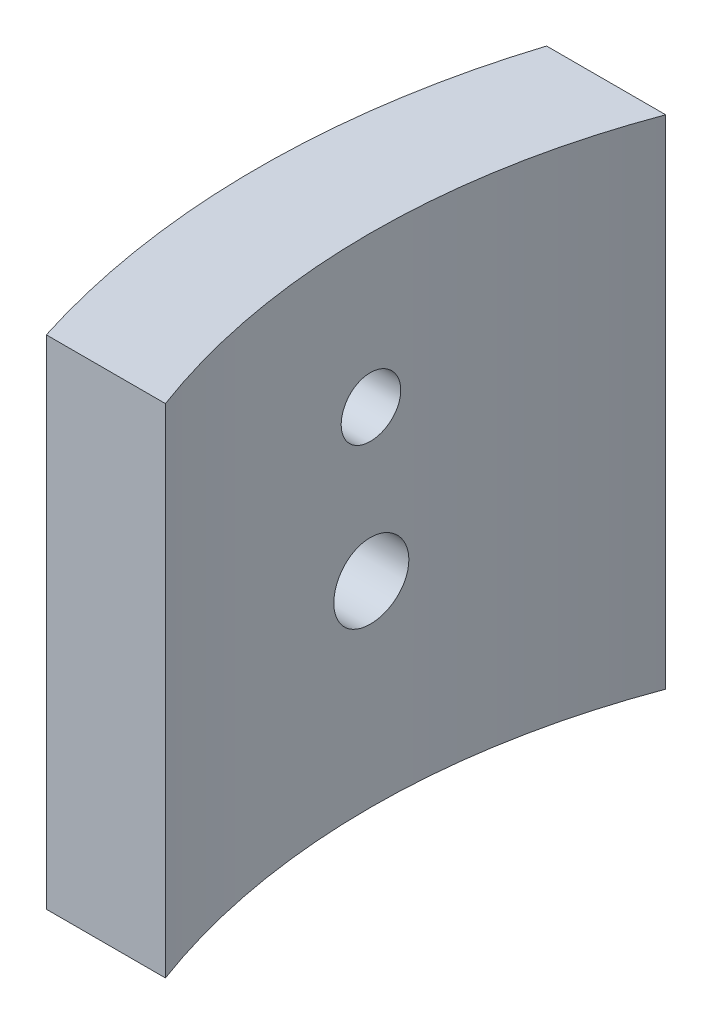
ISO-10303-21;
HEADER;
FILE_DESCRIPTION(('STEP AP214'),'2;1');
FILE_NAME('part.step','',(''),(''),'','','');
FILE_SCHEMA(('AUTOMOTIVE_DESIGN { 1 0 10303 214 1 1 1 1 }'));
ENDSEC;
DATA;
#1=APPLICATION_CONTEXT('core data for automotive mechanical design processes');
#2=APPLICATION_PROTOCOL_DEFINITION('international standard','automotive_design',2000,#1);
#3=PRODUCT_CONTEXT('',#1,'mechanical');
#4=PRODUCT('Part','Part','',(#3));
#5=PRODUCT_RELATED_PRODUCT_CATEGORY('part','',(#4));
#6=PRODUCT_DEFINITION_FORMATION('','',#4);
#7=PRODUCT_DEFINITION_CONTEXT('part definition',#1,'design');
#8=PRODUCT_DEFINITION('design','',#6,#7);
#9=PRODUCT_DEFINITION_SHAPE('','',#8);
#10=(LENGTH_UNIT() NAMED_UNIT(*) SI_UNIT(.MILLI.,.METRE.));
#11=(NAMED_UNIT(*) PLANE_ANGLE_UNIT() SI_UNIT($,.RADIAN.));
#12=(NAMED_UNIT(*) SI_UNIT($,.STERADIAN.) SOLID_ANGLE_UNIT());
#13=UNCERTAINTY_MEASURE_WITH_UNIT(LENGTH_MEASURE(1.E-05),#10,'distance_accuracy_value','');
#14=(GEOMETRIC_REPRESENTATION_CONTEXT(3) GLOBAL_UNCERTAINTY_ASSIGNED_CONTEXT((#13)) GLOBAL_UNIT_ASSIGNED_CONTEXT((#10,
#11,#12)) REPRESENTATION_CONTEXT('',''));
#15=CARTESIAN_POINT('',(0.,0.,0.));
#16=DIRECTION('',(0.,0.,1.));
#17=DIRECTION('',(1.,0.,0.));
#18=AXIS2_PLACEMENT_3D('',#15,#16,#17);
#19=CARTESIAN_POINT('',(0.,38.1,0.));
#20=DIRECTION('',(0.,-1.,0.));
#21=DIRECTION('',(0.,0.,-1.));
#22=AXIS2_PLACEMENT_3D('',#19,#20,#21);
#23=CYLINDRICAL_SURFACE('',#22,44.1043940806668);
#24=CARTESIAN_POINT('',(-44.0590237888081,22.0453977043266,-2.));
#25=CARTESIAN_POINT('',(-44.0590243990417,21.9331188090999,-1.99999504026224));
#26=CARTESIAN_POINT('',(-44.059457594174,21.8207599712269,-1.99051333666365));
#27=CARTESIAN_POINT('',(-44.0611439035289,21.5991409690323,-1.95282289828939));
#28=CARTESIAN_POINT('',(-44.0623979874924,21.4898846292606,-1.92459201395395));
#29=CARTESIAN_POINT('',(-44.0655837261527,21.2777131257266,-1.85021234894222));
#30=CARTESIAN_POINT('',(-44.0675150392582,21.1747947958113,-1.80407260016147));
#31=CARTESIAN_POINT('',(-44.07183718338,20.978192230565,-1.69519856298965));
#32=CARTESIAN_POINT('',(-44.0742279048652,20.8845058022224,-1.63246822875086));
#33=CARTESIAN_POINT('',(-44.0792018313536,20.7089179094863,-1.49213328396865));
#34=CARTESIAN_POINT('',(-44.081785178842,20.6270253028854,-1.41451759468417));
#35=CARTESIAN_POINT('',(-44.0868519077452,20.4774250479504,-1.24663689081444));
#36=CARTESIAN_POINT('',(-44.0893352851041,20.4097179746819,-1.15637136366641));
#37=CARTESIAN_POINT('',(-44.0939232379155,20.290387996913,-0.965709017333086));
#38=CARTESIAN_POINT('',(-44.0960276565927,20.238771742765,-0.86530803178697));
#39=CARTESIAN_POINT('',(-44.0996191363418,20.1531313546115,-0.657254173700703));
#40=CARTESIAN_POINT('',(-44.101106201476,20.1191071048492,-0.549601348883507));
#41=CARTESIAN_POINT('',(-44.103294457514,20.0696392636337,-0.33017890448785));
#42=CARTESIAN_POINT('',(-44.1039961934411,20.0541827854867,-0.218412195679959));
#43=CARTESIAN_POINT('',(-44.1045365332244,20.0422494824255,0.00613148555657009));
#44=CARTESIAN_POINT('',(-44.1043751429451,20.0457725285546,0.118908451115803));
#45=CARTESIAN_POINT('',(-44.1032078790649,20.0716875432299,0.342184063937901));
#46=CARTESIAN_POINT('',(-44.1022026265039,20.0940656354592,0.452684325483994));
#47=CARTESIAN_POINT('',(-44.0994616007306,20.1570340090446,0.668358242295614));
#48=CARTESIAN_POINT('',(-44.0977258248567,20.1976243567578,0.773531878151817));
#49=CARTESIAN_POINT('',(-44.0937182355526,20.2958808827919,0.975611752615508));
#50=CARTESIAN_POINT('',(-44.091446223388,20.3535533939594,1.07251490792658));
#51=CARTESIAN_POINT('',(-44.0866220771742,20.4843324984076,1.2552693773662));
#52=CARTESIAN_POINT('',(-44.0840699415177,20.5574391802526,1.3411206280722));
#53=CARTESIAN_POINT('',(-44.0789703028674,20.7170898667769,1.49941519997886));
#54=CARTESIAN_POINT('',(-44.0764228061129,20.8036459095705,1.57184638069112));
#55=CARTESIAN_POINT('',(-44.0716219560926,20.9876959778935,1.70115125204406));
#56=CARTESIAN_POINT('',(-44.0693686028951,21.0851900059653,1.75802493906852));
#57=CARTESIAN_POINT('',(-44.0654103171441,21.2883557433338,1.85459926051977));
#58=CARTESIAN_POINT('',(-44.0637053986152,21.3940276616728,1.89429945578845));
#59=CARTESIAN_POINT('',(-44.0610367907876,21.6105462965671,1.95539182542673));
#60=CARTESIAN_POINT('',(-44.0600730969019,21.7213929810957,1.9767841130885));
#61=CARTESIAN_POINT('',(-44.0589964552785,21.9450088997396,2.00063843719291));
#62=CARTESIAN_POINT('',(-44.0588827506357,22.0577763337251,2.00311731583438));
#63=CARTESIAN_POINT('',(-44.059516933974,22.282125609486,1.9891183904386));
#64=CARTESIAN_POINT('',(-44.0602648196199,22.3937074544738,1.97264063777987));
#65=CARTESIAN_POINT('',(-44.062537194939,22.6124709353796,1.92121015543386));
#66=CARTESIAN_POINT('',(-44.0640613611927,22.7196543837092,1.88626511948829));
#67=CARTESIAN_POINT('',(-44.0677142267263,22.9266343139471,1.79889981954337));
#68=CARTESIAN_POINT('',(-44.0698429288743,23.0264307608047,1.7464794726317));
#69=CARTESIAN_POINT('',(-44.0744667739158,23.2158813488044,1.62560829191931));
#70=CARTESIAN_POINT('',(-44.0769621751523,23.3055282600176,1.5571461361259));
#71=CARTESIAN_POINT('',(-44.082037236522,23.472062333708,1.40615128962695));
#72=CARTESIAN_POINT('',(-44.0846168971038,23.5489494282295,1.32361852398954));
#73=CARTESIAN_POINT('',(-44.0895719198985,23.687837822348,1.14675297379223));
#74=CARTESIAN_POINT('',(-44.0919471320754,23.7498282487014,1.05241164595835));
#75=CARTESIAN_POINT('',(-44.0962234115755,23.8570893052479,0.854650245895029));
#76=CARTESIAN_POINT('',(-44.0981244806878,23.9023599985366,0.75123020792794));
#77=CARTESIAN_POINT('',(-44.1012374923982,23.9748774816934,0.538287702199876));
#78=CARTESIAN_POINT('',(-44.1024497018401,24.0021312514542,0.428767615493966));
#79=CARTESIAN_POINT('',(-44.1040494306891,24.0378641173537,0.206700459798727));
#80=CARTESIAN_POINT('',(-44.1044369536586,24.0463432945917,0.0941534038869083));
#81=CARTESIAN_POINT('',(-44.1043436513105,24.0442854762555,-0.130664836209696));
#82=CARTESIAN_POINT('',(-44.1038636055085,24.033765551491,-0.242936177373258));
#83=CARTESIAN_POINT('',(-44.1020907543579,23.9940434008602,-0.464117113927691));
#84=CARTESIAN_POINT('',(-44.1007979474527,23.9648411392127,-0.573026702879541));
#85=CARTESIAN_POINT('',(-44.097545068798,23.8885865821962,-0.784396620558012));
#86=CARTESIAN_POINT('',(-44.0955849899102,23.841534095867,-0.886856880276512));
#87=CARTESIAN_POINT('',(-44.0912181191504,23.7309180591273,-1.08242377536315));
#88=CARTESIAN_POINT('',(-44.0888113416667,23.6673550404986,-1.17553071185518));
#89=CARTESIAN_POINT('',(-44.0838196151823,23.5254624413345,-1.34983244348865));
#90=CARTESIAN_POINT('',(-44.081234526927,23.4471212347809,-1.43101776984483));
#91=CARTESIAN_POINT('',(-44.0761783607003,23.2778985642765,-1.57910878244087));
#92=CARTESIAN_POINT('',(-44.0737073109857,23.1870140143324,-1.64601094429745));
#93=CARTESIAN_POINT('',(-44.0691564797967,22.9952230850397,-1.76366230597344));
#94=CARTESIAN_POINT('',(-44.067077041602,22.894308030403,-1.81439736069738));
#95=CARTESIAN_POINT('',(-44.0635495597143,22.6854589145261,-1.8981440618847));
#96=CARTESIAN_POINT('',(-44.0621007686351,22.5775333368893,-1.93117669845201));
#97=CARTESIAN_POINT('',(-44.0603825821113,22.3983446641878,-1.96989147622607));
#98=CARTESIAN_POINT('',(-44.0598752725266,22.3282429141104,-1.9811678156445));
#99=CARTESIAN_POINT('',(-44.0591956832243,22.187237313413,-1.9962236416578));
#100=CARTESIAN_POINT('',(-44.0590234032736,22.1163334633516,-2.0000031334719));
#101=CARTESIAN_POINT('',(-44.0590237888081,22.0453977043266,-2.));
#102=B_SPLINE_CURVE_WITH_KNOTS('',3,(#24,#25,#26,#27,#28,#29,#30,#31,#32,#33,#34,#35,#36,#37,
#38,#39,#40,#41,#42,#43,#44,#45,#46,#47,#48,#49,#50,#51,#52,#53,#54,#55,#56,#57,#58,#59,#60,#61,
#62,#63,#64,#65,#66,#67,#68,#69,#70,#71,#72,#73,#74,#75,#76,#77,#78,#79,#80,#81,#82,#83,#84,#85,
#86,#87,#88,#89,#90,#91,#92,#93,#94,#95,#96,#97,#98,#99,#100,#101),.UNSPECIFIED.,.T.,.F.,(4,2,2,
2,2,2,2,2,2,2,2,2,2,2,2,2,2,2,2,2,2,2,2,2,2,2,2,2,2,2,2,2,2,2,2,2,2,2,4),(0.,0.336577747932862,
0.67355382481844,1.01036017645689,1.34708632686833,1.68406407233082,2.02105547585109,
2.35818597417798,2.69531425413082,3.03220841963958,3.36910029611725,3.70574445432932,
4.04238983912761,4.37916018454449,4.71593246246813,5.05300793010627,5.39008347609496,
5.72716764122258,6.06424972040629,6.40103159634618,6.73781255950191,7.07445332524011,
7.41109568820666,7.74797636621007,8.08485883830001,8.42198646279997,8.75911281506109,
9.09610848536475,9.43310269996922,9.76979427383375,10.1064864925492,10.4431823132749,
10.7798672908313,11.1168182519089,11.4538522600797,11.7911803450558,12.1281075635474,
12.3407513965148,12.5533950814416),.UNSPECIFIED.);
#103=CARTESIAN_POINT('',(-44.0590237888081,22.0453977043266,-2.));
#104=VERTEX_POINT('',#103);
#105=EDGE_CURVE('E134',#104,#104,#102,.T.);
#106=ORIENTED_EDGE('',*,*,#105,.F.);
#107=EDGE_LOOP('',(#106));
#108=FACE_BOUND('',#107,.T.);
#109=CARTESIAN_POINT('',(-43.8465069415199,30.0703977043267,-4.76250000000001));
#110=CARTESIAN_POINT('',(-43.8465065309564,29.9370150287803,-4.76250137530376));
#111=CARTESIAN_POINT('',(-43.8471168179167,29.8036530968397,-4.75689447266601));
#112=CARTESIAN_POINT('',(-43.8495397569245,29.5378360452066,-4.7345087160224));
#113=CARTESIAN_POINT('',(-43.8513527150719,29.4053811650472,-4.71772701784067));
#114=CARTESIAN_POINT('',(-43.8561315531644,29.1422686790484,-4.67309361852635));
#115=CARTESIAN_POINT('',(-43.8590983240271,29.0116125430267,-4.64523336270208));
#116=CARTESIAN_POINT('',(-43.8661007232562,28.7530801753742,-4.57863572826138));
#117=CARTESIAN_POINT('',(-43.8701367429708,28.6252049801565,-4.53989436681544));
#118=CARTESIAN_POINT('',(-43.8791570871768,28.3733167596648,-4.45186526115511));
#119=CARTESIAN_POINT('',(-43.8841404588819,28.2492999984162,-4.40258810701371));
#120=CARTESIAN_POINT('',(-43.8949182415999,28.0058214078066,-4.29379979539951));
#121=CARTESIAN_POINT('',(-43.9007129511288,27.8863612756469,-4.23428486928769));
#122=CARTESIAN_POINT('',(-43.9129441493275,27.6529463891225,-4.10549543647735));
#123=CARTESIAN_POINT('',(-43.9193802736525,27.5389885632662,-4.03622646127171));
#124=CARTESIAN_POINT('',(-43.9327178083424,27.3172582819339,-3.88836636631439));
#125=CARTESIAN_POINT('',(-43.9396193903087,27.2094881350918,-3.80977180027824));
#126=CARTESIAN_POINT('',(-43.9537152704963,27.000574262673,-3.64355169707933));
#127=CARTESIAN_POINT('',(-43.9609104809707,26.8994542169924,-3.55589647375968));
#128=CARTESIAN_POINT('',(-43.9753708796073,26.7049128368333,-3.3723593936946));
#129=CARTESIAN_POINT('',(-43.9826360926568,26.6114943623936,-3.27647450753875));
#130=CARTESIAN_POINT('',(-43.9970264194929,26.4330815033402,-3.07720892817069));
#131=CARTESIAN_POINT('',(-44.0041515775141,26.3480844235171,-2.97383065162746));
#132=CARTESIAN_POINT('',(-44.0180658698236,26.1870499056262,-2.76023810872376));
#133=CARTESIAN_POINT('',(-44.0248548791661,26.1110157847915,-2.65002133429486));
#134=CARTESIAN_POINT('',(-44.0379160898569,25.9683314347992,-2.42330874870627));
#135=CARTESIAN_POINT('',(-44.0441871811712,25.9017011545542,-2.30680029312634));
#136=CARTESIAN_POINT('',(-44.0560210596333,25.7784791364571,-2.06854161979116));
#137=CARTESIAN_POINT('',(-44.0615835834177,25.7218911281059,-1.94678947540698));
#138=CARTESIAN_POINT('',(-44.0769555718001,25.5679065931107,-1.57503550207831));
#139=CARTESIAN_POINT('',(-44.0854646561081,25.4861295931305,-1.31828152562882));
#140=CARTESIAN_POINT('',(-44.0979875908934,25.3672244982917,-0.795733386354938));
#141=CARTESIAN_POINT('',(-44.1020189278895,25.3299226765287,-0.529978596352507));
#142=CARTESIAN_POINT('',(-44.1052015505222,25.300401627345,0.00408472100752453));
#143=CARTESIAN_POINT('',(-44.1043529820606,25.3081810520641,0.27239317177512));
#144=CARTESIAN_POINT('',(-44.0978829888639,25.3684848881474,0.80272518197026));
#145=CARTESIAN_POINT('',(-44.0922814625503,25.4208227571155,1.06477026759159));
#146=CARTESIAN_POINT('',(-44.0769583895802,25.568460634289,1.57633798427704));
#147=CARTESIAN_POINT('',(-44.067236781878,25.6637612790588,1.82586042973673));
#148=CARTESIAN_POINT('',(-44.0447318585004,25.894823832352,2.30588154216014));
#149=CARTESIAN_POINT('',(-44.0319423482658,26.0306677411457,2.53634043427181));
#150=CARTESIAN_POINT('',(-44.0047355341011,26.3389006962968,2.97125943883504));
#151=CARTESIAN_POINT('',(-43.9903181744672,26.5112909934201,3.175718661089));
#152=CARTESIAN_POINT('',(-43.9613854476045,26.8887710586733,3.55392773642759));
#153=CARTESIAN_POINT('',(-43.9468699556355,27.0940231751736,3.72751558491278));
#154=CARTESIAN_POINT('',(-43.9194501089016,27.5308391547976,4.03779878551054));
#155=CARTESIAN_POINT('',(-43.906545757158,27.7624030672614,4.17449406844027));
#156=CARTESIAN_POINT('',(-43.8838085631316,28.245399750536,4.40711401205456));
#157=CARTESIAN_POINT('',(-43.8739765408893,28.4968378035863,4.5030277901407));
#158=CARTESIAN_POINT('',(-43.8585139364762,29.0123798742716,4.65122934231966));
#159=CARTESIAN_POINT('',(-43.8528832045198,29.276483439995,4.70351867173077));
#160=CARTESIAN_POINT('',(-43.8464871377051,29.8084348514969,4.76277681931969));
#161=CARTESIAN_POINT('',(-43.845697429279,30.0762571241172,4.76997267802839));
#162=CARTESIAN_POINT('',(-43.8490084674653,30.6092935394765,4.73943669964974));
#163=CARTESIAN_POINT('',(-43.8531091368011,30.874507723361,4.70170557248704));
#164=CARTESIAN_POINT('',(-43.8657166998315,31.3941322398574,4.58257700429528));
#165=CARTESIAN_POINT('',(-43.8742126821357,31.6485676463672,4.50128767895934));
#166=CARTESIAN_POINT('',(-43.8946447461755,32.1401929886849,4.2974607949564));
#167=CARTESIAN_POINT('',(-43.9065809193113,32.3773824660874,4.17492214034845));
#168=CARTESIAN_POINT('',(-43.9326072998264,32.8288156418182,3.89150963651744));
#169=CARTESIAN_POINT('',(-43.9467058556715,33.0429646870236,3.73048579868569));
#170=CARTESIAN_POINT('',(-43.9754414510301,33.4412764009661,3.37488695110257));
#171=CARTESIAN_POINT('',(-43.9900785060975,33.6254382027274,3.18031097164373));
#172=CARTESIAN_POINT('',(-44.0183159443298,33.9593353768408,2.76214771739266));
#173=CARTESIAN_POINT('',(-44.0319116962205,34.1089223185423,2.53844157777638));
#174=CARTESIAN_POINT('',(-44.0564663714723,34.3683991459452,2.06893927483715));
#175=CARTESIAN_POINT('',(-44.0674253361203,34.4782896532274,1.82314345747734));
#176=CARTESIAN_POINT('',(-44.0854521521882,34.6550096038396,1.31699979732673));
#177=CARTESIAN_POINT('',(-44.0925279958029,34.7219275415176,1.05668306788743));
#178=CARTESIAN_POINT('',(-44.1020194342149,34.8110727459242,0.52828144980144));
#179=CARTESIAN_POINT('',(-44.1044351832915,34.833301492156,0.26019681862097));
#180=CARTESIAN_POINT('',(-44.1043726378466,34.8326876008119,-0.140920832053926));
#181=CARTESIAN_POINT('',(-44.1037423916554,34.8268692204749,-0.274190444524194));
#182=CARTESIAN_POINT('',(-44.1012904097247,34.8040857010611,-0.539749015039673));
#183=CARTESIAN_POINT('',(-44.0994691166989,34.7871247037,-0.672038318996618));
#184=CARTESIAN_POINT('',(-44.0946834637565,34.7421671492332,-0.934747144404359));
#185=CARTESIAN_POINT('',(-44.0917186862589,34.714166560574,-1.06516596471962));
#186=CARTESIAN_POINT('',(-44.0847315376241,34.6473495462274,-1.32312522594033));
#187=CARTESIAN_POINT('',(-44.0807095527169,34.6085370701408,-1.45066669958862));
#188=CARTESIAN_POINT('',(-44.0717195339658,34.520365480226,-1.70203928257204));
#189=CARTESIAN_POINT('',(-44.0667513402263,34.4710045836933,-1.82586976070286));
#190=CARTESIAN_POINT('',(-44.0560106940831,34.3621152934671,-2.06888573055336));
#191=CARTESIAN_POINT('',(-44.0502385351469,34.3025906080297,-2.18807289697448));
#192=CARTESIAN_POINT('',(-44.0380478605366,34.1737621427409,-2.42106029687361));
#193=CARTESIAN_POINT('',(-44.0316291143218,34.1044548713523,-2.53485858753741));
#194=CARTESIAN_POINT('',(-44.0183288466899,33.9565938821527,-2.75619158757575));
#195=CARTESIAN_POINT('',(-44.0114474933857,33.8780435156085,-2.86372854611024));
#196=CARTESIAN_POINT('',(-43.9973750342046,33.7117893452683,-3.07238689448243));
#197=CARTESIAN_POINT('',(-43.9901824886156,33.6240395394792,-3.17347153756734));
#198=CARTESIAN_POINT('',(-43.9757272960609,33.440382112466,-3.36786048622292));
#199=CARTESIAN_POINT('',(-43.9684646755814,33.3444774740994,-3.4611676121174));
#200=CARTESIAN_POINT('',(-43.9540673317082,33.1450934603586,-3.63944322987124));
#201=CARTESIAN_POINT('',(-43.946932688681,33.04160951934,-3.72440662227088));
#202=CARTESIAN_POINT('',(-43.9330004526485,32.8278825155519,-3.88530164854122));
#203=CARTESIAN_POINT('',(-43.9262027361644,32.7176419626135,-3.96123660569383));
#204=CARTESIAN_POINT('',(-43.9131128759782,32.4907646621539,-4.10380783026348));
#205=CARTESIAN_POINT('',(-43.9068224742335,32.374108012447,-4.17041259326118));
#206=CARTESIAN_POINT('',(-43.8949548502452,32.1356023012217,-4.29352310797116));
#207=CARTESIAN_POINT('',(-43.8893773676879,32.0137551567416,-4.35003254888246));
#208=CARTESIAN_POINT('',(-43.879097532248,31.7657903654982,-4.45253086336384));
#209=CARTESIAN_POINT('',(-43.874394472304,31.6396762674113,-4.49852824398447));
#210=CARTESIAN_POINT('',(-43.8659944258131,31.3840274118278,-4.57971304503142));
#211=CARTESIAN_POINT('',(-43.8622971949783,31.2544934933098,-4.61490309052632));
#212=CARTESIAN_POINT('',(-43.8550121215894,30.9510997604901,-4.68370215146596));
#213=CARTESIAN_POINT('',(-43.8518357674765,30.7762870716127,-4.71322234210733));
#214=CARTESIAN_POINT('',(-43.8475834552235,30.424436639344,-4.75262030363653));
#215=CARTESIAN_POINT('',(-43.8465074863451,30.2473989073331,-4.76249817494725));
#216=CARTESIAN_POINT('',(-43.8465069415199,30.0703977043267,-4.76250000000001));
#217=B_SPLINE_CURVE_WITH_KNOTS('',3,(#109,#110,#111,#112,#113,#114,#115,#116,#117,#118,#119,
#120,#121,#122,#123,#124,#125,#126,#127,#128,#129,#130,#131,#132,#133,#134,#135,#136,#137,#138,
#139,#140,#141,#142,#143,#144,#145,#146,#147,#148,#149,#150,#151,#152,#153,#154,#155,#156,#157,
#158,#159,#160,#161,#162,#163,#164,#165,#166,#167,#168,#169,#170,#171,#172,#173,#174,#175,#176,
#177,#178,#179,#180,#181,#182,#183,#184,#185,#186,#187,#188,#189,#190,#191,#192,#193,#194,#195,
#196,#197,#198,#199,#200,#201,#202,#203,#204,#205,#206,#207,#208,#209,#210,#211,#212,#213,#214,
#215,#216),.UNSPECIFIED.,.T.,.F.,(4,2,2,2,2,2,2,2,2,2,2,2,2,2,2,2,2,2,2,2,2,2,2,2,2,2,2,2,2,2,2,
2,2,2,2,2,2,2,2,2,2,2,2,2,2,2,2,2,2,2,2,2,2,4),(0.,0.399993199746715,0.800088243509987,
1.20049283632047,1.60104418133331,2.00119478841494,2.4014930118868,2.80156513484235,
3.20178556817314,3.60336154229045,4.0050859792711,4.40668142896124,4.80842504742618,
5.21100849450729,5.61374114164236,6.418314678968,7.21973502272083,8.02113140535562,
8.81918917485551,9.6172587692858,10.4169535557711,11.2166757154812,12.0204781367007,
12.8242820652414,13.6283003555071,14.4322899793289,15.2322283320961,16.0321540446113,
16.8301033987795,17.6280739550963,18.4292066711194,19.2303625449679,20.0348964351511,
20.8394177271156,21.6422768924107,22.4451094774008,22.8449146169346,23.2445712327353,
23.6443739347077,24.0440307791661,24.4437552199373,24.843334131751,25.2430560210162,
25.6426334271957,26.0443139643997,26.4458482026239,26.8476263398313,27.2492561254135,
27.6522109536958,28.0550182250135,28.4574983546783,28.8598806456919,29.3906815104158,
29.9214796613717),.UNSPECIFIED.);
#218=CARTESIAN_POINT('',(-43.8465069415199,30.0703977043267,-4.76250000000001));
#219=VERTEX_POINT('',#218);
#220=EDGE_CURVE('E11',#219,#219,#217,.T.);
#221=ORIENTED_EDGE('',*,*,#220,.F.);
#222=EDGE_LOOP('',(#221));
#223=FACE_BOUND('',#222,.T.);
#224=CARTESIAN_POINT('',(0.,11.5791977043266,0.));
#225=DIRECTION('',(0.,-1.,0.));
#226=DIRECTION('',(0.,0.,-1.));
#227=AXIS2_PLACEMENT_3D('',#224,#225,#226);
#228=CIRCLE('',#227,44.1043940806668);
#229=CARTESIAN_POINT('',(-42.0401635608469,11.5791977043266,-13.335));
#230=VERTEX_POINT('',#229);
#231=CARTESIAN_POINT('',(-42.0401635608469,11.5791977043266,13.335));
#232=VERTEX_POINT('',#231);
#233=EDGE_CURVE('E81',#230,#232,#228,.F.);
#234=ORIENTED_EDGE('',*,*,#233,.T.);
#235=DIRECTION('',(0.,-1.,0.));
#236=VECTOR('',#235,1.);
#237=CARTESIAN_POINT('',(-42.0401635608469,38.1,13.335));
#238=LINE('',#237,#236);
#239=CARTESIAN_POINT('',(-42.0401635608469,38.1,13.335));
#240=VERTEX_POINT('',#239);
#241=EDGE_CURVE('E100',#240,#232,#238,.T.);
#242=ORIENTED_EDGE('',*,*,#241,.F.);
#243=CARTESIAN_POINT('',(0.,38.1,0.));
#244=DIRECTION('',(0.,1.,0.));
#245=DIRECTION('',(0.,0.,1.));
#246=AXIS2_PLACEMENT_3D('',#243,#244,#245);
#247=CIRCLE('',#246,44.1043940806668);
#248=CARTESIAN_POINT('',(-42.0401635608469,38.1,-13.335));
#249=VERTEX_POINT('',#248);
#250=EDGE_CURVE('E144',#249,#240,#247,.T.);
#251=ORIENTED_EDGE('',*,*,#250,.F.);
#252=DIRECTION('',(0.,-1.,0.));
#253=VECTOR('',#252,1.);
#254=CARTESIAN_POINT('',(-42.0401635608469,38.1,-13.335));
#255=LINE('',#254,#253);
#256=EDGE_CURVE('E98',#249,#230,#255,.T.);
#257=ORIENTED_EDGE('',*,*,#256,.T.);
#258=EDGE_LOOP('',(#234,#242,#251,#257));
#259=FACE_BOUND('',#258,.T.);
#260=ADVANCED_FACE('F33',(#108,#223,#259),#23,.T.);
#261=CARTESIAN_POINT('',(0.,38.1,0.));
#262=DIRECTION('',(0.,-1.,0.));
#263=DIRECTION('',(0.,0.,-1.));
#264=AXIS2_PLACEMENT_3D('',#261,#262,#263);
#265=CYLINDRICAL_SURFACE('',#264,38.1);
#266=CARTESIAN_POINT('',(-38.0474703495515,22.0453977043266,-2.));
#267=CARTESIAN_POINT('',(-38.0474710546729,21.9331398928542,-1.99999504824444));
#268=CARTESIAN_POINT('',(-38.0479725095062,21.8208026541177,-1.99051689069613));
#269=CARTESIAN_POINT('',(-38.0499244771662,21.5992277024951,-1.95284136009362));
#270=CARTESIAN_POINT('',(-38.051376105727,21.4899937912013,-1.92462197973472));
#271=CARTESIAN_POINT('',(-38.055063538444,21.2778672604536,-1.8502746673313));
#272=CARTESIAN_POINT('',(-38.0572989402149,21.1749714188745,-1.80415592343538));
#273=CARTESIAN_POINT('',(-38.0623015276112,20.9784093793409,-1.69533327170802));
#274=CARTESIAN_POINT('',(-38.0650685883528,20.8847410217004,-1.63263325742965));
#275=CARTESIAN_POINT('',(-38.0708261770562,20.7091619656379,-1.4923512620149));
#276=CARTESIAN_POINT('',(-38.0738169182536,20.6272627096855,-1.41475496691442));
#277=CARTESIAN_POINT('',(-38.0796828664911,20.4776443128529,-1.2469119066266));
#278=CARTESIAN_POINT('',(-38.0825580687929,20.4099257530672,-1.15666462328165));
#279=CARTESIAN_POINT('',(-38.0878706264306,20.2905588098804,-0.96602055667337));
#280=CARTESIAN_POINT('',(-38.090307735729,20.2389194448768,-0.865618119322095));
#281=CARTESIAN_POINT('',(-38.0944673048082,20.1532345950313,-0.657553579932415));
#282=CARTESIAN_POINT('',(-38.0961897704042,20.1191889670243,-0.549891536975495));
#283=CARTESIAN_POINT('',(-38.098724517484,20.0696885379384,-0.330470140885562));
#284=CARTESIAN_POINT('',(-38.0995376446182,20.0542164631693,-0.218714694538213));
#285=CARTESIAN_POINT('',(-38.1001649240089,20.0422490208093,0.00580989691477898));
#286=CARTESIAN_POINT('',(-38.0999790847449,20.0457534921395,0.11857903340778));
#287=CARTESIAN_POINT('',(-38.0986300839424,20.0716253451285,0.341812932397961));
#288=CARTESIAN_POINT('',(-38.0974678856047,20.0939741365095,0.452279856054683));
#289=CARTESIAN_POINT('',(-38.094298171997,20.15687140597,0.667892017040104));
#290=CARTESIAN_POINT('',(-38.0922906529168,20.1974199660827,0.773037230379494));
#291=CARTESIAN_POINT('',(-38.0876547545013,20.295586918217,0.975081111500119));
#292=CARTESIAN_POINT('',(-38.0850260675225,20.3532137721488,1.07197566055338));
#293=CARTESIAN_POINT('',(-38.0794438291461,20.4838953218584,1.25472272253966));
#294=CARTESIAN_POINT('',(-38.0764902752068,20.5569501383447,1.34057514907064));
#295=CARTESIAN_POINT('',(-38.0705866727919,20.7165189319606,1.49890936775545));
#296=CARTESIAN_POINT('',(-38.0676366328434,20.8030490390792,1.57137490546291));
#297=CARTESIAN_POINT('',(-38.062076216131,20.9870555049101,1.7007530787779));
#298=CARTESIAN_POINT('',(-38.0594658394647,21.0845318667607,1.7576657099263));
#299=CARTESIAN_POINT('',(-38.0548793976098,21.2876737514849,1.85432115775649));
#300=CARTESIAN_POINT('',(-38.0529033554951,21.3933395720751,1.8940633498848));
#301=CARTESIAN_POINT('',(-38.049809293279,21.6098564234814,1.95523886176806));
#302=CARTESIAN_POINT('',(-38.0486912660644,21.7207074113037,1.97667233330474));
#303=CARTESIAN_POINT('',(-38.0474406331002,21.9443063159587,2.000601856092));
#304=CARTESIAN_POINT('',(-38.0473068530827,22.0570518114339,2.00312047400902));
#305=CARTESIAN_POINT('',(-38.0480367349632,22.2813637951514,1.98920769857108));
#306=CARTESIAN_POINT('',(-38.0489003932195,22.3929302876968,1.97277637440304));
#307=CARTESIAN_POINT('',(-38.0515267397444,22.6116538357239,1.92144886157481));
#308=CARTESIAN_POINT('',(-38.0532889245172,22.7188133243994,1.88656301363006));
#309=CARTESIAN_POINT('',(-38.0575132873922,22.9257559816728,1.79932720118943));
#310=CARTESIAN_POINT('',(-38.0599754699645,23.0255391031615,1.74697712516994));
#311=CARTESIAN_POINT('',(-38.0653251822079,23.2150003409396,1.62624101088177));
#312=CARTESIAN_POINT('',(-38.0682131128087,23.3046687901279,1.55783982084904));
#313=CARTESIAN_POINT('',(-38.0740874227916,23.4712580573593,1.4069652581044));
#314=CARTESIAN_POINT('',(-38.0770738028636,23.5481787860423,1.32449178675554));
#315=CARTESIAN_POINT('',(-38.0828118626823,23.6871650198325,1.14771681877244));
#316=CARTESIAN_POINT('',(-38.085563310365,23.7492159434988,1.05340384918466));
#317=CARTESIAN_POINT('',(-38.0905181043043,23.8566014693391,0.855685019909702));
#318=CARTESIAN_POINT('',(-38.0927214531285,23.9019361498187,0.752279202819872));
#319=CARTESIAN_POINT('',(-38.0963306314498,23.9745768311481,0.539364117196038));
#320=CARTESIAN_POINT('',(-38.0977368727362,24.0018921420775,0.429858032258735));
#321=CARTESIAN_POINT('',(-38.099594997294,24.0377491879716,0.207806369349575));
#322=CARTESIAN_POINT('',(-38.1000468866774,24.0462910431672,0.0952608108481032));
#323=CARTESIAN_POINT('',(-38.0999454073661,24.0443575644636,-0.129530397813827));
#324=CARTESIAN_POINT('',(-38.0993932471833,24.0339050928626,-0.241776245882444));
#325=CARTESIAN_POINT('',(-38.0973482007726,23.9943269547847,-0.462917101544319));
#326=CARTESIAN_POINT('',(-38.0958553127914,23.9652012535074,-0.571812102892338));
#327=CARTESIAN_POINT('',(-38.0920967402758,23.8891082099057,-0.783164634778035));
#328=CARTESIAN_POINT('',(-38.0898310517601,23.8421407756647,-0.885622132147968));
#329=CARTESIAN_POINT('',(-38.0847816081437,23.7317012707073,-1.08119919158479));
#330=CARTESIAN_POINT('',(-38.0819978684971,23.6682296923096,-1.17431903207927));
#331=CARTESIAN_POINT('',(-38.0762217464145,23.5265011036121,-1.34869209117096));
#332=CARTESIAN_POINT('',(-38.0732291392658,23.4482280092628,-1.42993222880055));
#333=CARTESIAN_POINT('',(-38.067374161198,23.2791316313192,-1.57814507251642));
#334=CARTESIAN_POINT('',(-38.0645118224714,23.1883052676658,-1.64511426681492));
#335=CARTESIAN_POINT('',(-38.0592381499375,22.9966032846842,-1.76291891456049));
#336=CARTESIAN_POINT('',(-38.056827274757,22.8957176041124,-1.8137379977749));
#337=CARTESIAN_POINT('',(-38.0527355823806,22.6869083211784,-1.89765550865305));
#338=CARTESIAN_POINT('',(-38.051053904616,22.5789931887192,-1.93077483563256));
#339=CARTESIAN_POINT('',(-38.0490548295057,22.3995741257051,-1.96967976640888));
#340=CARTESIAN_POINT('',(-38.0484632762815,22.3292319152208,-1.98103530385916));
#341=CARTESIAN_POINT('',(-38.0476708129232,22.1877363503133,-1.99619698707609));
#342=CARTESIAN_POINT('',(-38.0474699024176,22.1165829966616,-2.00000314002351));
#343=CARTESIAN_POINT('',(-38.0474703495515,22.0453977043266,-2.));
#344=B_SPLINE_CURVE_WITH_KNOTS('',3,(#266,#267,#268,#269,#270,#271,#272,#273,#274,#275,#276,
#277,#278,#279,#280,#281,#282,#283,#284,#285,#286,#287,#288,#289,#290,#291,#292,#293,#294,#295,
#296,#297,#298,#299,#300,#301,#302,#303,#304,#305,#306,#307,#308,#309,#310,#311,#312,#313,#314,
#315,#316,#317,#318,#319,#320,#321,#322,#323,#324,#325,#326,#327,#328,#329,#330,#331,#332,#333,
#334,#335,#336,#337,#338,#339,#340,#341,#342,#343),.UNSPECIFIED.,.T.,.F.,(4,2,2,2,2,2,2,2,2,2,2,
2,2,2,2,2,2,2,2,2,2,2,2,2,2,2,2,2,2,2,2,2,2,2,2,2,2,2,4),(0.,0.336513577634117,
0.673423014300267,1.01015973597308,1.34681745646646,1.68380030833228,2.02079696633464,
2.35798229784572,2.69516488554302,3.03203364469974,3.36889954440981,3.70543350783239,
4.04196898815413,4.37867149380354,4.71537663391154,5.05248795435351,5.38959937144797,
5.72672304952113,6.06384393276688,6.40056254459731,6.73727992705988,7.07380883453104,
7.41033989106013,7.7471899097485,8.08404228961928,8.42122365000223,8.75840343087267,
9.09540886411217,9.43241213906009,9.76901005261785,10.1056085934818,10.4422088684495,
10.7787991037801,11.1157572184167,11.4527981560576,11.7901796467296,12.127161882813,
12.3405531815528,12.5539442773203),.UNSPECIFIED.);
#345=CARTESIAN_POINT('',(-38.0474703495515,22.0453977043266,-2.));
#346=VERTEX_POINT('',#345);
#347=EDGE_CURVE('E38',#346,#346,#344,.T.);
#348=ORIENTED_EDGE('',*,*,#347,.T.);
#349=EDGE_LOOP('',(#348));
#350=FACE_BOUND('',#349,.T.);
#351=CARTESIAN_POINT('',(-38.0669127162947,30.0703977043267,1.58749999999999));
#352=CARTESIAN_POINT('',(-38.066913161719,30.1595267409628,1.58749606037634));
#353=CARTESIAN_POINT('',(-38.0672291070234,30.2487194194017,1.57996866899218));
#354=CARTESIAN_POINT('',(-38.0684590117711,30.4246455138595,1.55004646401668));
#355=CARTESIAN_POINT('',(-38.0693736804485,30.5113758857963,1.52763401747016));
#356=CARTESIAN_POINT('',(-38.0716972419605,30.6798033631817,1.46858339678575));
#357=CARTESIAN_POINT('',(-38.0731058876714,30.7615029614136,1.43195233487162));
#358=CARTESIAN_POINT('',(-38.0762583633807,30.9175709765776,1.3455148865344));
#359=CARTESIAN_POINT('',(-38.0780021129431,30.9919411463475,1.29571166078958));
#360=CARTESIAN_POINT('',(-38.0816298088072,31.1313172430355,1.18430155143168));
#361=CARTESIAN_POINT('',(-38.0835138450982,31.196317079323,1.12268705066604));
#362=CARTESIAN_POINT('',(-38.0872089556512,31.3150556813008,0.989418064698524));
#363=CARTESIAN_POINT('',(-38.0890200269674,31.3687939927113,0.917763174670881));
#364=CARTESIAN_POINT('',(-38.0923657097258,31.4634987258169,0.766418297681569));
#365=CARTESIAN_POINT('',(-38.0939002254484,31.5044607290327,0.686725543535977));
#366=CARTESIAN_POINT('',(-38.096518998899,31.5724216299967,0.521586675980106));
#367=CARTESIAN_POINT('',(-38.0976032592688,31.5994206096729,0.436140596330756));
#368=CARTESIAN_POINT('',(-38.0991987505247,31.6386738667163,0.26197364055883));
#369=CARTESIAN_POINT('',(-38.0997103169098,31.6509367771627,0.173254713257239));
#370=CARTESIAN_POINT('',(-38.1001038882216,31.6603964244356,-0.0049837903148148));
#371=CARTESIAN_POINT('',(-38.099985896937,31.6575932519318,-0.0945033617636603));
#372=CARTESIAN_POINT('',(-38.0991339351806,31.6370075077681,-0.271743564088213));
#373=CARTESIAN_POINT('',(-38.0984003471315,31.619234235853,-0.359465277184465));
#374=CARTESIAN_POINT('',(-38.096400284615,31.5692272159596,-0.530678918647964));
#375=CARTESIAN_POINT('',(-38.0951338084183,31.5369934210542,-0.614170833287725));
#376=CARTESIAN_POINT('',(-38.0922100077487,31.4589697161659,-0.774584812084734));
#377=CARTESIAN_POINT('',(-38.0905525607966,31.4131755569785,-0.851504807150051));
#378=CARTESIAN_POINT('',(-38.0870335379558,31.3093341714161,-0.996568830788555));
#379=CARTESIAN_POINT('',(-38.0851719610908,31.251286886442,-1.06471281738894));
#380=CARTESIAN_POINT('',(-38.0814527223519,31.1245343958996,-1.19034468707978));
#381=CARTESIAN_POINT('',(-38.0795950645294,31.0558211227241,-1.24782443103578));
#382=CARTESIAN_POINT('',(-38.0760945176802,30.9097155645421,-1.35043349806333));
#383=CARTESIAN_POINT('',(-38.074451628699,30.8323232777048,-1.39556281852975));
#384=CARTESIAN_POINT('',(-38.0715659848354,30.6710518168258,-1.47218919300052));
#385=CARTESIAN_POINT('',(-38.0703232383478,30.587172506735,-1.50368596100499));
#386=CARTESIAN_POINT('',(-38.0683783526477,30.4153101718399,-1.55214781210117));
#387=CARTESIAN_POINT('',(-38.067676210609,30.3273271684911,-1.56911297115972));
#388=CARTESIAN_POINT('',(-38.0668922285278,30.1498258192699,-1.58801999776023));
#389=CARTESIAN_POINT('',(-38.0668099224472,30.0603086776435,-1.58997315244738));
#390=CARTESIAN_POINT('',(-38.0672736772174,29.8822178525079,-1.57883016297279));
#391=CARTESIAN_POINT('',(-38.0678197366355,29.7936441668481,-1.56573405312523));
#392=CARTESIAN_POINT('',(-38.0694782459643,29.6199861374538,-1.52487363986102));
#393=CARTESIAN_POINT('',(-38.0705904970582,29.5349005801963,-1.49711448520783));
#394=CARTESIAN_POINT('',(-38.0732558489548,29.3705967449855,-1.42772117598279));
#395=CARTESIAN_POINT('',(-38.0748089515165,29.2913784904445,-1.38608696604857));
#396=CARTESIAN_POINT('',(-38.078182078405,29.1410060145352,-1.29009635858624));
#397=CARTESIAN_POINT('',(-38.0800022617707,29.0698566430204,-1.23573236926991));
#398=CARTESIAN_POINT('',(-38.0837038179208,28.9376903536385,-1.11583651399168));
#399=CARTESIAN_POINT('',(-38.085585190984,28.8766734819377,-1.05030459714858));
#400=CARTESIAN_POINT('',(-38.0891984187386,28.7664664259146,-0.909884679997075));
#401=CARTESIAN_POINT('',(-38.0909301809205,28.7172835258678,-0.834990960003231));
#402=CARTESIAN_POINT('',(-38.0940476760071,28.6321903216277,-0.678002411500925));
#403=CARTESIAN_POINT('',(-38.0954334100724,28.5962799729139,-0.595907607148419));
#404=CARTESIAN_POINT('',(-38.0977022170987,28.5387639994545,-0.426874531993985));
#405=CARTESIAN_POINT('',(-38.0985854547696,28.517153687017,-0.339937858545984));
#406=CARTESIAN_POINT('',(-38.09975037196,28.4888358643757,-0.163666388144793));
#407=CARTESIAN_POINT('',(-38.100032053504,28.4821283040183,-0.0743315992632594));
#408=CARTESIAN_POINT('',(-38.0999621209958,28.4838069196527,0.104127745183836));
#409=CARTESIAN_POINT('',(-38.0996109871244,28.4921816511852,0.193252408813686));
#410=CARTESIAN_POINT('',(-38.0983159142036,28.5237635114924,0.368829382587947));
#411=CARTESIAN_POINT('',(-38.0973719740065,28.5469706689778,0.455281687559206));
#412=CARTESIAN_POINT('',(-38.0949975457333,28.6075564944536,0.62306286200892));
#413=CARTESIAN_POINT('',(-38.0935670514506,28.6449353432184,0.704391666116431));
#414=CARTESIAN_POINT('',(-38.0903805375964,28.7328010275274,0.859619124463491));
#415=CARTESIAN_POINT('',(-38.0886245288657,28.7832874265679,0.933518026017656));
#416=CARTESIAN_POINT('',(-38.084983257275,28.8959742840566,1.07184400049047));
#417=CARTESIAN_POINT('',(-38.0830979110092,28.958182347469,1.13626487551319));
#418=CARTESIAN_POINT('',(-38.0794108721455,29.0925486750813,1.25376773133541));
#419=CARTESIAN_POINT('',(-38.0776092003065,29.1647093910017,1.30684691000128));
#420=CARTESIAN_POINT('',(-38.0742917741576,29.3169757072304,1.40017691493353));
#421=CARTESIAN_POINT('',(-38.0727762526223,29.3970876955304,1.44041731544247));
#422=CARTESIAN_POINT('',(-38.0702059468311,29.5628761342326,1.50682916458378));
#423=CARTESIAN_POINT('',(-38.0691506161556,29.648545845848,1.53301730709885));
#424=CARTESIAN_POINT('',(-38.0679004032728,29.7906930520223,1.56367812978148));
#425=CARTESIAN_POINT('',(-38.0675316424777,29.8462488802223,1.57260000488095));
#426=CARTESIAN_POINT('',(-38.0670376585929,29.9579939351802,1.58451218064177));
#427=CARTESIAN_POINT('',(-38.0669124353613,30.0141831615691,1.58750248475861));
#428=CARTESIAN_POINT('',(-38.0669127162947,30.0703977043267,1.58749999999999));
#429=B_SPLINE_CURVE_WITH_KNOTS('',3,(#351,#352,#353,#354,#355,#356,#357,#358,#359,#360,#361,
#362,#363,#364,#365,#366,#367,#368,#369,#370,#371,#372,#373,#374,#375,#376,#377,#378,#379,#380,
#381,#382,#383,#384,#385,#386,#387,#388,#389,#390,#391,#392,#393,#394,#395,#396,#397,#398,#399,
#400,#401,#402,#403,#404,#405,#406,#407,#408,#409,#410,#411,#412,#413,#414,#415,#416,#417,#418,
#419,#420,#421,#422,#423,#424,#425,#426,#427,#428),.UNSPECIFIED.,.T.,.F.,(4,2,2,2,2,2,2,2,2,2,2,
2,2,2,2,2,2,2,2,2,2,2,2,2,2,2,2,2,2,2,2,2,2,2,2,2,2,2,4),(0.,0.267181912096279,
0.534680895907965,0.802046247438627,1.06934750240936,1.33682172483646,1.60430673485672,
1.87188414793123,2.13945999097897,2.40687899903147,2.67429639772354,2.94154779345105,
3.20880005646687,3.47613615303037,3.74347352812828,4.01101410785232,4.27855474401013,
4.54610099268122,4.81364584269292,5.0809895128234,5.34833257337837,5.61558182176318,
5.88283213650223,6.15024224180392,6.41765356546173,6.68522907262245,6.95280368223852,
7.22029053476703,7.48777648709216,7.75505955629692,8.02234314287583,8.28963013904583,
8.55690823524968,8.82436034114472,9.09187844882481,9.35961324548338,9.6270292688442,
9.7955435750481,9.96405778308233),.UNSPECIFIED.);
#430=CARTESIAN_POINT('',(-38.0669127162947,30.0703977043267,1.58749999999999));
#431=VERTEX_POINT('',#430);
#432=EDGE_CURVE('E94',#431,#431,#429,.T.);
#433=ORIENTED_EDGE('',*,*,#432,.T.);
#434=EDGE_LOOP('',(#433));
#435=FACE_BOUND('',#434,.T.);
#436=CARTESIAN_POINT('',(0.,11.5791977043266,0.));
#437=DIRECTION('',(0.,-1.,0.));
#438=DIRECTION('',(0.,0.,-1.));
#439=AXIS2_PLACEMENT_3D('',#436,#437,#438);
#440=CIRCLE('',#439,38.1);
#441=CARTESIAN_POINT('',(-35.6901635608469,11.5791977043266,13.335));
#442=VERTEX_POINT('',#441);
#443=CARTESIAN_POINT('',(-35.6901635608468,11.5791977043266,-13.335));
#444=VERTEX_POINT('',#443);
#445=EDGE_CURVE('E53',#442,#444,#440,.T.);
#446=ORIENTED_EDGE('',*,*,#445,.T.);
#447=DIRECTION('',(0.,-1.,0.));
#448=VECTOR('',#447,1.);
#449=CARTESIAN_POINT('',(-35.6901635608469,38.1,-13.335));
#450=LINE('',#449,#448);
#451=CARTESIAN_POINT('',(-35.6901635608469,38.1,-13.335));
#452=VERTEX_POINT('',#451);
#453=EDGE_CURVE('E46',#452,#444,#450,.T.);
#454=ORIENTED_EDGE('',*,*,#453,.F.);
#455=CARTESIAN_POINT('',(0.,38.1,0.));
#456=DIRECTION('',(0.,-1.,0.));
#457=DIRECTION('',(0.,0.,1.));
#458=AXIS2_PLACEMENT_3D('',#455,#456,#457);
#459=CIRCLE('',#458,38.1);
#460=CARTESIAN_POINT('',(-35.6901635608469,38.1,13.335));
#461=VERTEX_POINT('',#460);
#462=EDGE_CURVE('E147',#461,#452,#459,.T.);
#463=ORIENTED_EDGE('',*,*,#462,.F.);
#464=DIRECTION('',(0.,-1.,0.));
#465=VECTOR('',#464,1.);
#466=CARTESIAN_POINT('',(-35.6901635608469,38.1,13.335));
#467=LINE('',#466,#465);
#468=EDGE_CURVE('E92',#461,#442,#467,.T.);
#469=ORIENTED_EDGE('',*,*,#468,.T.);
#470=EDGE_LOOP('',(#446,#454,#463,#469));
#471=FACE_BOUND('',#470,.T.);
#472=ADVANCED_FACE('F35',(#350,#435,#471),#265,.F.);
#473=CARTESIAN_POINT('',(-42.0401635608469,38.1,-13.335));
#474=DIRECTION('',(0.,0.,1.));
#475=DIRECTION('',(1.,0.,0.));
#476=AXIS2_PLACEMENT_3D('',#473,#474,#475);
#477=PLANE('',#476);
#478=DIRECTION('',(-1.,0.,0.));
#479=VECTOR('',#478,1.);
#480=CARTESIAN_POINT('',(-42.0401635608469,11.5791977043266,-13.335));
#481=LINE('',#480,#479);
#482=EDGE_CURVE('E78',#444,#230,#481,.T.);
#483=ORIENTED_EDGE('',*,*,#482,.T.);
#484=ORIENTED_EDGE('',*,*,#256,.F.);
#485=DIRECTION('',(-1.,0.,0.));
#486=VECTOR('',#485,1.);
#487=CARTESIAN_POINT('',(-42.0401635608469,38.1,-13.335));
#488=LINE('',#487,#486);
#489=EDGE_CURVE('E97',#452,#249,#488,.T.);
#490=ORIENTED_EDGE('',*,*,#489,.F.);
#491=ORIENTED_EDGE('',*,*,#453,.T.);
#492=EDGE_LOOP('',(#483,#484,#490,#491));
#493=FACE_BOUND('',#492,.T.);
#494=ADVANCED_FACE('F96',(#493),#477,.F.);
#495=CARTESIAN_POINT('',(-42.0401635608469,38.1,13.335));
#496=DIRECTION('',(0.,0.,-1.));
#497=DIRECTION('',(-1.,0.,0.));
#498=AXIS2_PLACEMENT_3D('',#495,#496,#497);
#499=PLANE('',#498);
#500=DIRECTION('',(1.,0.,0.));
#501=VECTOR('',#500,1.);
#502=CARTESIAN_POINT('',(-42.0401635608469,11.5791977043266,13.335));
#503=LINE('',#502,#501);
#504=EDGE_CURVE('E93',#232,#442,#503,.T.);
#505=ORIENTED_EDGE('',*,*,#504,.T.);
#506=ORIENTED_EDGE('',*,*,#468,.F.);
#507=DIRECTION('',(1.,0.,0.));
#508=VECTOR('',#507,1.);
#509=CARTESIAN_POINT('',(-42.0401635608469,38.1,13.335));
#510=LINE('',#509,#508);
#511=EDGE_CURVE('E61',#240,#461,#510,.T.);
#512=ORIENTED_EDGE('',*,*,#511,.F.);
#513=ORIENTED_EDGE('',*,*,#241,.T.);
#514=EDGE_LOOP('',(#505,#506,#512,#513));
#515=FACE_BOUND('',#514,.T.);
#516=ADVANCED_FACE('F119',(#515),#499,.F.);
#517=CARTESIAN_POINT('',(0.,38.1,0.));
#518=DIRECTION('',(0.,1.,0.));
#519=DIRECTION('',(0.,0.,1.));
#520=AXIS2_PLACEMENT_3D('',#517,#518,#519);
#521=PLANE('',#520);
#522=ORIENTED_EDGE('',*,*,#462,.T.);
#523=ORIENTED_EDGE('',*,*,#489,.T.);
#524=ORIENTED_EDGE('',*,*,#250,.T.);
#525=ORIENTED_EDGE('',*,*,#511,.T.);
#526=EDGE_LOOP('',(#522,#523,#524,#525));
#527=FACE_BOUND('',#526,.T.);
#528=ADVANCED_FACE('F115',(#527),#521,.T.);
#529=CARTESIAN_POINT('',(-57.9203841816037,30.0703977043267,0.));
#530=DIRECTION('',(1.,0.,0.));
#531=DIRECTION('',(0.,0.,-1.));
#532=AXIS2_PLACEMENT_3D('',#529,#530,#531);
#533=CYLINDRICAL_SURFACE('',#532,4.7625);
#534=CARTESIAN_POINT('',(-44.45,30.0703977043267,0.));
#535=DIRECTION('',(-1.,0.,0.));
#536=DIRECTION('',(0.,0.,1.));
#537=AXIS2_PLACEMENT_3D('',#534,#535,#536);
#538=CIRCLE('',#537,4.7625);
#539=CARTESIAN_POINT('',(-44.45,30.0703977043267,4.76249999999999));
#540=VERTEX_POINT('',#539);
#541=EDGE_CURVE('E149',#540,#540,#538,.T.);
#542=ORIENTED_EDGE('',*,*,#541,.F.);
#543=EDGE_LOOP('',(#542));
#544=FACE_BOUND('',#543,.T.);
#545=ORIENTED_EDGE('',*,*,#220,.T.);
#546=EDGE_LOOP('',(#545));
#547=FACE_BOUND('',#546,.T.);
#548=ADVANCED_FACE('F109',(#544,#547),#533,.T.);
#549=CARTESIAN_POINT('',(-57.9203841816037,30.0703977043267,0.));
#550=DIRECTION('',(1.,0.,0.));
#551=DIRECTION('',(0.,0.,-1.));
#552=AXIS2_PLACEMENT_3D('',#549,#550,#551);
#553=CYLINDRICAL_SURFACE('',#552,1.5875);
#554=CARTESIAN_POINT('',(-44.45,30.0703977043267,0.));
#555=DIRECTION('',(-1.,0.,0.));
#556=DIRECTION('',(0.,0.,1.));
#557=AXIS2_PLACEMENT_3D('',#554,#555,#556);
#558=CIRCLE('',#557,1.5875);
#559=CARTESIAN_POINT('',(-44.45,30.0703977043267,1.58749999999999));
#560=VERTEX_POINT('',#559);
#561=EDGE_CURVE('E86',#560,#560,#558,.T.);
#562=ORIENTED_EDGE('',*,*,#561,.T.);
#563=EDGE_LOOP('',(#562));
#564=FACE_BOUND('',#563,.T.);
#565=ORIENTED_EDGE('',*,*,#432,.F.);
#566=EDGE_LOOP('',(#565));
#567=FACE_BOUND('',#566,.T.);
#568=ADVANCED_FACE('F114',(#564,#567),#553,.F.);
#569=CARTESIAN_POINT('',(-44.45,17.3703977043266,-10.668));
#570=DIRECTION('',(-1.,0.,0.));
#571=DIRECTION('',(0.,0.,1.));
#572=AXIS2_PLACEMENT_3D('',#569,#570,#571);
#573=PLANE('',#572);
#574=ORIENTED_EDGE('',*,*,#561,.F.);
#575=EDGE_LOOP('',(#574));
#576=FACE_BOUND('',#575,.T.);
#577=ORIENTED_EDGE('',*,*,#541,.T.);
#578=EDGE_LOOP('',(#577));
#579=FACE_BOUND('',#578,.T.);
#580=ADVANCED_FACE('F168',(#576,#579),#573,.T.);
#581=CARTESIAN_POINT('',(-25.851541112489,11.5791977043266,-32.7970417432623));
#582=DIRECTION('',(0.,-1.,0.));
#583=DIRECTION('',(0.492423560103469,0.,0.870355695939899));
#584=AXIS2_PLACEMENT_3D('',#581,#582,#583);
#585=PLANE('',#584);
#586=ORIENTED_EDGE('',*,*,#233,.F.);
#587=ORIENTED_EDGE('',*,*,#482,.F.);
#588=ORIENTED_EDGE('',*,*,#445,.F.);
#589=ORIENTED_EDGE('',*,*,#504,.F.);
#590=EDGE_LOOP('',(#586,#587,#588,#589));
#591=FACE_BOUND('',#590,.T.);
#592=ADVANCED_FACE('F79',(#591),#585,.T.);
#593=CARTESIAN_POINT('',(-44.451,22.0453977043266,0.));
#594=DIRECTION('',(1.,0.,0.));
#595=DIRECTION('',(0.,0.,-1.));
#596=AXIS2_PLACEMENT_3D('',#593,#594,#595);
#597=CYLINDRICAL_SURFACE('',#596,2.);
#598=ORIENTED_EDGE('',*,*,#105,.T.);
#599=EDGE_LOOP('',(#598));
#600=FACE_BOUND('',#599,.T.);
#601=ORIENTED_EDGE('',*,*,#347,.F.);
#602=EDGE_LOOP('',(#601));
#603=FACE_BOUND('',#602,.T.);
#604=ADVANCED_FACE('F167',(#600,#603),#597,.F.);
#605=CLOSED_SHELL('',(#260,#472,#494,#516,#528,#548,#568,#580,#592,#604));
#606=MANIFOLD_SOLID_BREP('B2',#605);
#607=ADVANCED_BREP_SHAPE_REPRESENTATION('',(#18,#606),#14);
#608=SHAPE_DEFINITION_REPRESENTATION(#9,#607);
ENDSEC;
END-ISO-10303-21;
